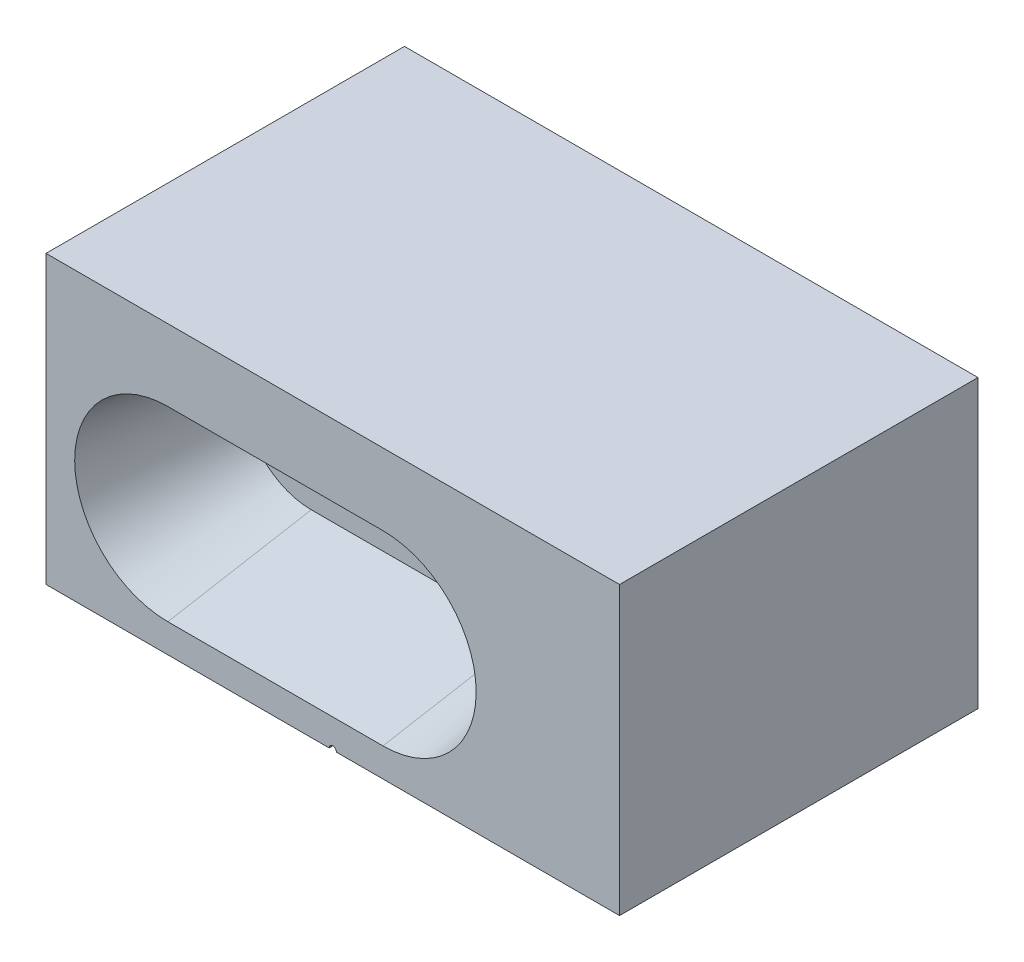
ISO-10303-21;
HEADER;
FILE_DESCRIPTION(('STEP AP214'),'2;1');
FILE_NAME('part.step','',(''),(''),'','','');
FILE_SCHEMA(('AUTOMOTIVE_DESIGN { 1 0 10303 214 1 1 1 1 }'));
ENDSEC;
DATA;
#1=APPLICATION_CONTEXT('core data for automotive mechanical design processes');
#2=APPLICATION_PROTOCOL_DEFINITION('international standard','automotive_design',2000,#1);
#3=PRODUCT_CONTEXT('',#1,'mechanical');
#4=PRODUCT('Part','Part','',(#3));
#5=PRODUCT_RELATED_PRODUCT_CATEGORY('part','',(#4));
#6=PRODUCT_DEFINITION_FORMATION('','',#4);
#7=PRODUCT_DEFINITION_CONTEXT('part definition',#1,'design');
#8=PRODUCT_DEFINITION('design','',#6,#7);
#9=PRODUCT_DEFINITION_SHAPE('','',#8);
#10=(LENGTH_UNIT() NAMED_UNIT(*) SI_UNIT(.MILLI.,.METRE.));
#11=(NAMED_UNIT(*) PLANE_ANGLE_UNIT() SI_UNIT($,.RADIAN.));
#12=(NAMED_UNIT(*) SI_UNIT($,.STERADIAN.) SOLID_ANGLE_UNIT());
#13=UNCERTAINTY_MEASURE_WITH_UNIT(LENGTH_MEASURE(1.E-05),#10,'distance_accuracy_value','');
#14=(GEOMETRIC_REPRESENTATION_CONTEXT(3) GLOBAL_UNCERTAINTY_ASSIGNED_CONTEXT((#13)) GLOBAL_UNIT_ASSIGNED_CONTEXT((#10,
#11,#12)) REPRESENTATION_CONTEXT('',''));
#15=CARTESIAN_POINT('',(0.,0.,0.));
#16=DIRECTION('',(0.,0.,1.));
#17=DIRECTION('',(1.,0.,0.));
#18=AXIS2_PLACEMENT_3D('',#15,#16,#17);
#19=CARTESIAN_POINT('',(149.,29.8959813156576,57.8606367334853));
#20=DIRECTION('',(0.,1.,0.));
#21=DIRECTION('',(-1.,0.,0.));
#22=AXIS2_PLACEMENT_3D('',#19,#20,#21);
#23=PLANE('',#22);
#24=DIRECTION('',(1.,0.,0.));
#25=VECTOR('',#24,1.);
#26=CARTESIAN_POINT('',(149.,29.8959813156576,7.86063673348532));
#27=LINE('',#26,#25);
#28=CARTESIAN_POINT('',(149.,29.8959813156576,7.86063673348532));
#29=VERTEX_POINT('',#28);
#30=CARTESIAN_POINT('',(188.5,29.8959813156576,7.86063673348532));
#31=VERTEX_POINT('',#30);
#32=EDGE_CURVE('E155',#29,#31,#27,.T.);
#33=ORIENTED_EDGE('',*,*,#32,.T.);
#34=DIRECTION('',(0.,0.,1.));
#35=VECTOR('',#34,1.);
#36=CARTESIAN_POINT('',(188.5,29.8959813156576,6.44642317111223));
#37=LINE('',#36,#35);
#38=CARTESIAN_POINT('',(188.5,29.8959813156576,57.8606367334853));
#39=VERTEX_POINT('',#38);
#40=EDGE_CURVE('E59',#31,#39,#37,.T.);
#41=ORIENTED_EDGE('',*,*,#40,.T.);
#42=DIRECTION('',(1.,0.,0.));
#43=VECTOR('',#42,1.);
#44=CARTESIAN_POINT('',(149.,29.8959813156576,57.8606367334853));
#45=LINE('',#44,#43);
#46=CARTESIAN_POINT('',(149.,29.8959813156576,57.8606367334853));
#47=VERTEX_POINT('',#46);
#48=EDGE_CURVE('E133',#47,#39,#45,.T.);
#49=ORIENTED_EDGE('',*,*,#48,.F.);
#50=DIRECTION('',(0.,0.,-1.));
#51=VECTOR('',#50,1.);
#52=CARTESIAN_POINT('',(149.,29.8959813156576,57.8606367334853));
#53=LINE('',#52,#51);
#54=EDGE_CURVE('E52',#47,#29,#53,.T.);
#55=ORIENTED_EDGE('',*,*,#54,.T.);
#56=EDGE_LOOP('',(#33,#41,#49,#55));
#57=FACE_BOUND('',#56,.T.);
#58=ADVANCED_FACE('F44',(#57),#23,.F.);
#59=CARTESIAN_POINT('',(149.,69.8959813156576,57.8606367334853));
#60=DIRECTION('',(1.,0.,0.));
#61=DIRECTION('',(0.,0.,-1.));
#62=AXIS2_PLACEMENT_3D('',#59,#60,#61);
#63=PLANE('',#62);
#64=DIRECTION('',(0.,-1.,0.));
#65=VECTOR('',#64,1.);
#66=CARTESIAN_POINT('',(149.,69.8959813156576,7.86063673348532));
#67=LINE('',#66,#65);
#68=CARTESIAN_POINT('',(149.,69.8959813156576,7.86063673348532));
#69=VERTEX_POINT('',#68);
#70=EDGE_CURVE('E150',#69,#29,#67,.T.);
#71=ORIENTED_EDGE('',*,*,#70,.T.);
#72=ORIENTED_EDGE('',*,*,#54,.F.);
#73=DIRECTION('',(0.,-1.,0.));
#74=VECTOR('',#73,1.);
#75=CARTESIAN_POINT('',(149.,69.8959813156576,57.8606367334853));
#76=LINE('',#75,#74);
#77=CARTESIAN_POINT('',(149.,69.8959813156576,57.8606367334853));
#78=VERTEX_POINT('',#77);
#79=EDGE_CURVE('E139',#78,#47,#76,.T.);
#80=ORIENTED_EDGE('',*,*,#79,.F.);
#81=DIRECTION('',(0.,0.,-1.));
#82=VECTOR('',#81,1.);
#83=CARTESIAN_POINT('',(149.,69.8959813156576,57.8606367334853));
#84=LINE('',#83,#82);
#85=EDGE_CURVE('E149',#78,#69,#84,.T.);
#86=ORIENTED_EDGE('',*,*,#85,.T.);
#87=EDGE_LOOP('',(#71,#72,#80,#86));
#88=FACE_BOUND('',#87,.T.);
#89=ADVANCED_FACE('F46',(#88),#63,.F.);
#90=CARTESIAN_POINT('',(189.5,29.8959813156576,57.8606367334853));
#91=VERTEX_POINT('',#90);
#92=CARTESIAN_POINT('',(229.,29.8959813156576,57.8606367334853));
#93=VERTEX_POINT('',#92);
#94=EDGE_CURVE('E130',#91,#93,#45,.T.);
#95=ORIENTED_EDGE('',*,*,#94,.F.);
#96=DIRECTION('',(0.,0.,1.));
#97=VECTOR('',#96,1.);
#98=CARTESIAN_POINT('',(189.5,29.8959813156576,6.44642317111223));
#99=LINE('',#98,#97);
#100=CARTESIAN_POINT('',(189.5,29.8959813156576,7.86063673348533));
#101=VERTEX_POINT('',#100);
#102=EDGE_CURVE('E118',#91,#101,#99,.F.);
#103=ORIENTED_EDGE('',*,*,#102,.T.);
#104=CARTESIAN_POINT('',(229.,29.8959813156576,7.86063673348532));
#105=VERTEX_POINT('',#104);
#106=EDGE_CURVE('E153',#101,#105,#27,.T.);
#107=ORIENTED_EDGE('',*,*,#106,.T.);
#108=DIRECTION('',(0.,0.,-1.));
#109=VECTOR('',#108,1.);
#110=CARTESIAN_POINT('',(229.,29.8959813156576,57.8606367334853));
#111=LINE('',#110,#109);
#112=EDGE_CURVE('E137',#93,#105,#111,.T.);
#113=ORIENTED_EDGE('',*,*,#112,.F.);
#114=EDGE_LOOP('',(#95,#103,#107,#113));
#115=FACE_BOUND('',#114,.T.);
#116=ADVANCED_FACE('F135',(#115),#23,.F.);
#117=CARTESIAN_POINT('',(229.,69.8959813156576,57.8606367334853));
#118=DIRECTION('',(-1.,0.,0.));
#119=DIRECTION('',(0.,-1.,0.));
#120=AXIS2_PLACEMENT_3D('',#117,#118,#119);
#121=PLANE('',#120);
#122=DIRECTION('',(0.,1.,0.));
#123=VECTOR('',#122,1.);
#124=CARTESIAN_POINT('',(229.,69.8959813156576,7.86063673348532));
#125=LINE('',#124,#123);
#126=CARTESIAN_POINT('',(229.,69.8959813156576,7.86063673348532));
#127=VERTEX_POINT('',#126);
#128=EDGE_CURVE('E158',#105,#127,#125,.T.);
#129=ORIENTED_EDGE('',*,*,#128,.T.);
#130=DIRECTION('',(0.,0.,-1.));
#131=VECTOR('',#130,1.);
#132=CARTESIAN_POINT('',(229.,69.8959813156576,57.8606367334853));
#133=LINE('',#132,#131);
#134=CARTESIAN_POINT('',(229.,69.8959813156576,57.8606367334853));
#135=VERTEX_POINT('',#134);
#136=EDGE_CURVE('E163',#135,#127,#133,.T.);
#137=ORIENTED_EDGE('',*,*,#136,.F.);
#138=DIRECTION('',(0.,1.,0.));
#139=VECTOR('',#138,1.);
#140=CARTESIAN_POINT('',(229.,69.8959813156576,57.8606367334853));
#141=LINE('',#140,#139);
#142=EDGE_CURVE('E141',#93,#135,#141,.T.);
#143=ORIENTED_EDGE('',*,*,#142,.F.);
#144=ORIENTED_EDGE('',*,*,#112,.T.);
#145=EDGE_LOOP('',(#129,#137,#143,#144));
#146=FACE_BOUND('',#145,.T.);
#147=ADVANCED_FACE('F178',(#146),#121,.F.);
#148=CARTESIAN_POINT('',(149.,69.8959813156576,57.8606367334853));
#149=DIRECTION('',(0.,-1.,0.));
#150=DIRECTION('',(0.,0.,-1.));
#151=AXIS2_PLACEMENT_3D('',#148,#149,#150);
#152=PLANE('',#151);
#153=DIRECTION('',(-1.,0.,0.));
#154=VECTOR('',#153,1.);
#155=CARTESIAN_POINT('',(149.,69.8959813156576,7.86063673348532));
#156=LINE('',#155,#154);
#157=EDGE_CURVE('E142',#127,#69,#156,.T.);
#158=ORIENTED_EDGE('',*,*,#157,.T.);
#159=ORIENTED_EDGE('',*,*,#85,.F.);
#160=DIRECTION('',(-1.,0.,0.));
#161=VECTOR('',#160,1.);
#162=CARTESIAN_POINT('',(149.,69.8959813156576,57.8606367334853));
#163=LINE('',#162,#161);
#164=EDGE_CURVE('E147',#135,#78,#163,.T.);
#165=ORIENTED_EDGE('',*,*,#164,.F.);
#166=ORIENTED_EDGE('',*,*,#136,.T.);
#167=EDGE_LOOP('',(#158,#159,#165,#166));
#168=FACE_BOUND('',#167,.T.);
#169=ADVANCED_FACE('F182',(#168),#152,.F.);
#170=CARTESIAN_POINT('',(0.,0.,57.8606367334853));
#171=DIRECTION('',(0.,0.,1.));
#172=DIRECTION('',(1.,0.,0.));
#173=AXIS2_PLACEMENT_3D('',#170,#171,#172);
#174=PLANE('',#173);
#175=CARTESIAN_POINT('',(189.,29.8959813156576,57.8606367334853));
#176=DIRECTION('',(0.,0.,1.));
#177=DIRECTION('',(1.,0.,0.));
#178=AXIS2_PLACEMENT_3D('',#175,#176,#177);
#179=CIRCLE('',#178,0.499999999999999);
#180=EDGE_CURVE('E121',#91,#39,#179,.T.);
#181=ORIENTED_EDGE('',*,*,#180,.F.);
#182=ORIENTED_EDGE('',*,*,#94,.T.);
#183=ORIENTED_EDGE('',*,*,#142,.T.);
#184=ORIENTED_EDGE('',*,*,#164,.T.);
#185=ORIENTED_EDGE('',*,*,#79,.T.);
#186=ORIENTED_EDGE('',*,*,#48,.T.);
#187=EDGE_LOOP('',(#181,#182,#183,#184,#185,#186));
#188=FACE_BOUND('',#187,.T.);
#189=CARTESIAN_POINT('',(166.,46.8959813156576,57.8606367334853));
#190=DIRECTION('',(0.,0.,1.));
#191=DIRECTION('',(1.,0.,0.));
#192=AXIS2_PLACEMENT_3D('',#189,#190,#191);
#193=CIRCLE('',#192,13.);
#194=CARTESIAN_POINT('',(166.,59.8959813156576,57.8606367334853));
#195=VERTEX_POINT('',#194);
#196=CARTESIAN_POINT('',(166.,33.8959813156576,57.8606367334853));
#197=VERTEX_POINT('',#196);
#198=EDGE_CURVE('E66',#195,#197,#193,.T.);
#199=ORIENTED_EDGE('',*,*,#198,.F.);
#200=DIRECTION('',(-1.,0.,0.));
#201=VECTOR('',#200,1.);
#202=CARTESIAN_POINT('',(166.,59.8959813156576,57.8606367334853));
#203=LINE('',#202,#201);
#204=CARTESIAN_POINT('',(196.,59.8959813156576,57.8606367334853));
#205=VERTEX_POINT('',#204);
#206=EDGE_CURVE('E362',#205,#195,#203,.T.);
#207=ORIENTED_EDGE('',*,*,#206,.F.);
#208=CARTESIAN_POINT('',(196.,46.8959813156576,57.8606367334853));
#209=DIRECTION('',(0.,0.,1.));
#210=DIRECTION('',(1.,0.,0.));
#211=AXIS2_PLACEMENT_3D('',#208,#209,#210);
#212=CIRCLE('',#211,13.);
#213=CARTESIAN_POINT('',(196.,33.8959813156576,57.8606367334853));
#214=VERTEX_POINT('',#213);
#215=EDGE_CURVE('E359',#214,#205,#212,.T.);
#216=ORIENTED_EDGE('',*,*,#215,.F.);
#217=DIRECTION('',(1.,0.,0.));
#218=VECTOR('',#217,1.);
#219=CARTESIAN_POINT('',(166.,33.8959813156576,57.8606367334853));
#220=LINE('',#219,#218);
#221=EDGE_CURVE('E351',#197,#214,#220,.T.);
#222=ORIENTED_EDGE('',*,*,#221,.F.);
#223=EDGE_LOOP('',(#199,#207,#216,#222));
#224=FACE_BOUND('',#223,.T.);
#225=ADVANCED_FACE('F128',(#188,#224),#174,.T.);
#226=CARTESIAN_POINT('',(0.,0.,7.86063673348532));
#227=DIRECTION('',(0.,0.,1.));
#228=DIRECTION('',(1.,0.,0.));
#229=AXIS2_PLACEMENT_3D('',#226,#227,#228);
#230=PLANE('',#229);
#231=ORIENTED_EDGE('',*,*,#106,.F.);
#232=CARTESIAN_POINT('',(189.,29.8959813156576,7.86063673348532));
#233=DIRECTION('',(0.,0.,1.));
#234=DIRECTION('',(1.,0.,0.));
#235=AXIS2_PLACEMENT_3D('',#232,#233,#234);
#236=CIRCLE('',#235,0.499999999999999);
#237=EDGE_CURVE('E11',#101,#31,#236,.T.);
#238=ORIENTED_EDGE('',*,*,#237,.T.);
#239=ORIENTED_EDGE('',*,*,#32,.F.);
#240=ORIENTED_EDGE('',*,*,#70,.F.);
#241=ORIENTED_EDGE('',*,*,#157,.F.);
#242=ORIENTED_EDGE('',*,*,#128,.F.);
#243=EDGE_LOOP('',(#231,#238,#239,#240,#241,#242));
#244=FACE_BOUND('',#243,.T.);
#245=ADVANCED_FACE('F175',(#244),#230,.F.);
#246=CARTESIAN_POINT('',(166.,46.8959813156576,57.8606367334853));
#247=DIRECTION('',(0.,0.,1.));
#248=DIRECTION('',(1.,0.,0.));
#249=AXIS2_PLACEMENT_3D('',#246,#247,#248);
#250=CONICAL_SURFACE('',#249,13.,0.174532925199433);
#251=ORIENTED_EDGE('',*,*,#198,.T.);
#252=DIRECTION('',(0.,-0.173648177666931,0.984807753012208));
#253=VECTOR('',#252,1.);
#254=CARTESIAN_POINT('',(166.,33.8959813156576,57.8606367334853));
#255=LINE('',#254,#253);
#256=CARTESIAN_POINT('',(166.,37.4225209298269,37.8606367334853));
#257=VERTEX_POINT('',#256);
#258=EDGE_CURVE('E368',#257,#197,#255,.T.);
#259=ORIENTED_EDGE('',*,*,#258,.F.);
#260=CARTESIAN_POINT('',(166.,46.8959813156576,37.8606367334853));
#261=DIRECTION('',(0.,0.,1.));
#262=DIRECTION('',(1.,0.,0.));
#263=AXIS2_PLACEMENT_3D('',#260,#261,#262);
#264=CIRCLE('',#263,9.47346038583069);
#265=CARTESIAN_POINT('',(166.,56.3694417014883,37.8606367334853));
#266=VERTEX_POINT('',#265);
#267=EDGE_CURVE('E365',#266,#257,#264,.T.);
#268=ORIENTED_EDGE('',*,*,#267,.F.);
#269=DIRECTION('',(0.,0.173648177666931,0.984807753012208));
#270=VECTOR('',#269,1.);
#271=CARTESIAN_POINT('',(166.,59.8959813156576,57.8606367334853));
#272=LINE('',#271,#270);
#273=EDGE_CURVE('E154',#266,#195,#272,.T.);
#274=ORIENTED_EDGE('',*,*,#273,.T.);
#275=EDGE_LOOP('',(#251,#259,#268,#274));
#276=FACE_BOUND('',#275,.T.);
#277=ADVANCED_FACE('F230',(#276),#250,.F.);
#278=CARTESIAN_POINT('',(166.,59.8959813156576,57.8606367334853));
#279=DIRECTION('',(0.,0.984807753012208,-0.173648177666931));
#280=DIRECTION('',(0.,0.173648177666931,0.984807753012208));
#281=AXIS2_PLACEMENT_3D('',#278,#279,#280);
#282=PLANE('',#281);
#283=ORIENTED_EDGE('',*,*,#206,.T.);
#284=ORIENTED_EDGE('',*,*,#273,.F.);
#285=DIRECTION('',(-1.,0.,0.));
#286=VECTOR('',#285,1.);
#287=CARTESIAN_POINT('',(166.,56.3694417014883,37.8606367334853));
#288=LINE('',#287,#286);
#289=CARTESIAN_POINT('',(196.,56.3694417014883,37.8606367334853));
#290=VERTEX_POINT('',#289);
#291=EDGE_CURVE('E371',#290,#266,#288,.T.);
#292=ORIENTED_EDGE('',*,*,#291,.F.);
#293=DIRECTION('',(0.,0.173648177666931,0.984807753012208));
#294=VECTOR('',#293,1.);
#295=CARTESIAN_POINT('',(196.,59.8959813156576,57.8606367334853));
#296=LINE('',#295,#294);
#297=EDGE_CURVE('E367',#290,#205,#296,.T.);
#298=ORIENTED_EDGE('',*,*,#297,.T.);
#299=EDGE_LOOP('',(#283,#284,#292,#298));
#300=FACE_BOUND('',#299,.T.);
#301=ADVANCED_FACE('F241',(#300),#282,.F.);
#302=CARTESIAN_POINT('',(196.,46.8959813156576,57.8606367334853));
#303=DIRECTION('',(0.,0.,1.));
#304=DIRECTION('',(1.,0.,0.));
#305=AXIS2_PLACEMENT_3D('',#302,#303,#304);
#306=CONICAL_SURFACE('',#305,13.,0.174532925199433);
#307=ORIENTED_EDGE('',*,*,#215,.T.);
#308=ORIENTED_EDGE('',*,*,#297,.F.);
#309=CARTESIAN_POINT('',(196.,46.8959813156576,37.8606367334853));
#310=DIRECTION('',(0.,0.,1.));
#311=DIRECTION('',(1.,0.,0.));
#312=AXIS2_PLACEMENT_3D('',#309,#310,#311);
#313=CIRCLE('',#312,9.4734603858307);
#314=CARTESIAN_POINT('',(196.,37.4225209298269,37.8606367334853));
#315=VERTEX_POINT('',#314);
#316=EDGE_CURVE('E379',#315,#290,#313,.T.);
#317=ORIENTED_EDGE('',*,*,#316,.F.);
#318=DIRECTION('',(0.,-0.173648177666931,0.984807753012208));
#319=VECTOR('',#318,1.);
#320=CARTESIAN_POINT('',(196.,33.8959813156576,57.8606367334853));
#321=LINE('',#320,#319);
#322=EDGE_CURVE('E370',#315,#214,#321,.T.);
#323=ORIENTED_EDGE('',*,*,#322,.T.);
#324=EDGE_LOOP('',(#307,#308,#317,#323));
#325=FACE_BOUND('',#324,.T.);
#326=ADVANCED_FACE('F251',(#325),#306,.F.);
#327=CARTESIAN_POINT('',(166.,33.8959813156576,57.8606367334853));
#328=DIRECTION('',(0.,-0.984807753012208,-0.173648177666931));
#329=DIRECTION('',(0.,0.173648177666931,-0.984807753012208));
#330=AXIS2_PLACEMENT_3D('',#327,#328,#329);
#331=PLANE('',#330);
#332=ORIENTED_EDGE('',*,*,#221,.T.);
#333=ORIENTED_EDGE('',*,*,#322,.F.);
#334=DIRECTION('',(1.,0.,0.));
#335=VECTOR('',#334,1.);
#336=CARTESIAN_POINT('',(166.,37.4225209298269,37.8606367334853));
#337=LINE('',#336,#335);
#338=EDGE_CURVE('E376',#257,#315,#337,.T.);
#339=ORIENTED_EDGE('',*,*,#338,.F.);
#340=ORIENTED_EDGE('',*,*,#258,.T.);
#341=EDGE_LOOP('',(#332,#333,#339,#340));
#342=FACE_BOUND('',#341,.T.);
#343=ADVANCED_FACE('F262',(#342),#331,.F.);
#344=CARTESIAN_POINT('',(166.,46.8959813156576,37.8606367334853));
#345=DIRECTION('',(0.,0.,1.));
#346=DIRECTION('',(1.,0.,0.));
#347=AXIS2_PLACEMENT_3D('',#344,#345,#346);
#348=PLANE('',#347);
#349=CARTESIAN_POINT('',(181.,51.3694417014883,37.8606367334853));
#350=DIRECTION('',(0.,0.,1.));
#351=DIRECTION('',(1.,0.,0.));
#352=AXIS2_PLACEMENT_3D('',#349,#350,#351);
#353=CIRCLE('',#352,2.5);
#354=CARTESIAN_POINT('',(183.5,51.3694417014883,37.8606367334853));
#355=VERTEX_POINT('',#354);
#356=EDGE_CURVE('E349',#355,#355,#353,.T.);
#357=ORIENTED_EDGE('',*,*,#356,.F.);
#358=EDGE_LOOP('',(#357));
#359=FACE_BOUND('',#358,.T.);
#360=ORIENTED_EDGE('',*,*,#267,.T.);
#361=ORIENTED_EDGE('',*,*,#338,.T.);
#362=ORIENTED_EDGE('',*,*,#316,.T.);
#363=ORIENTED_EDGE('',*,*,#291,.T.);
#364=EDGE_LOOP('',(#360,#361,#362,#363));
#365=FACE_BOUND('',#364,.T.);
#366=ADVANCED_FACE('F273',(#359,#365),#348,.T.);
#367=CARTESIAN_POINT('',(181.,51.3694417014883,27.8606367334853));
#368=DIRECTION('',(0.,0.,1.));
#369=DIRECTION('',(1.,0.,0.));
#370=AXIS2_PLACEMENT_3D('',#367,#368,#369);
#371=CYLINDRICAL_SURFACE('',#370,2.5);
#372=CARTESIAN_POINT('',(181.,51.3694417014883,27.8606367334853));
#373=DIRECTION('',(0.,0.,1.));
#374=DIRECTION('',(1.,0.,0.));
#375=AXIS2_PLACEMENT_3D('',#372,#373,#374);
#376=CIRCLE('',#375,2.5);
#377=CARTESIAN_POINT('',(183.5,51.3694417014883,27.8606367334853));
#378=VERTEX_POINT('',#377);
#379=EDGE_CURVE('E348',#378,#378,#376,.T.);
#380=ORIENTED_EDGE('',*,*,#379,.F.);
#381=EDGE_LOOP('',(#380));
#382=FACE_BOUND('',#381,.T.);
#383=ORIENTED_EDGE('',*,*,#356,.T.);
#384=EDGE_LOOP('',(#383));
#385=FACE_BOUND('',#384,.T.);
#386=ADVANCED_FACE('F284',(#382,#385),#371,.F.);
#387=CARTESIAN_POINT('',(181.,51.3694417014883,27.8606367334853));
#388=DIRECTION('',(0.,0.,1.));
#389=DIRECTION('',(1.,0.,0.));
#390=AXIS2_PLACEMENT_3D('',#387,#388,#389);
#391=PLANE('',#390);
#392=ORIENTED_EDGE('',*,*,#379,.T.);
#393=EDGE_LOOP('',(#392));
#394=FACE_BOUND('',#393,.T.);
#395=ADVANCED_FACE('F295',(#394),#391,.T.);
#396=CARTESIAN_POINT('',(189.,29.8959813156576,6.44642317111223));
#397=DIRECTION('',(0.,0.,1.));
#398=DIRECTION('',(1.,0.,0.));
#399=AXIS2_PLACEMENT_3D('',#396,#397,#398);
#400=CYLINDRICAL_SURFACE('',#399,0.499999999999999);
#401=ORIENTED_EDGE('',*,*,#237,.F.);
#402=ORIENTED_EDGE('',*,*,#102,.F.);
#403=ORIENTED_EDGE('',*,*,#180,.T.);
#404=ORIENTED_EDGE('',*,*,#40,.F.);
#405=EDGE_LOOP('',(#401,#402,#403,#404));
#406=FACE_BOUND('',#405,.T.);
#407=ADVANCED_FACE('F120',(#406),#400,.F.);
#408=CLOSED_SHELL('',(#58,#89,#116,#147,#169,#225,#245,#277,#301,#326,#343,#366,#386,#395,#407));
#409=MANIFOLD_SOLID_BREP('B2',#408);
#410=ADVANCED_BREP_SHAPE_REPRESENTATION('',(#18,#409),#14);
#411=SHAPE_DEFINITION_REPRESENTATION(#9,#410);
ENDSEC;
END-ISO-10303-21;
